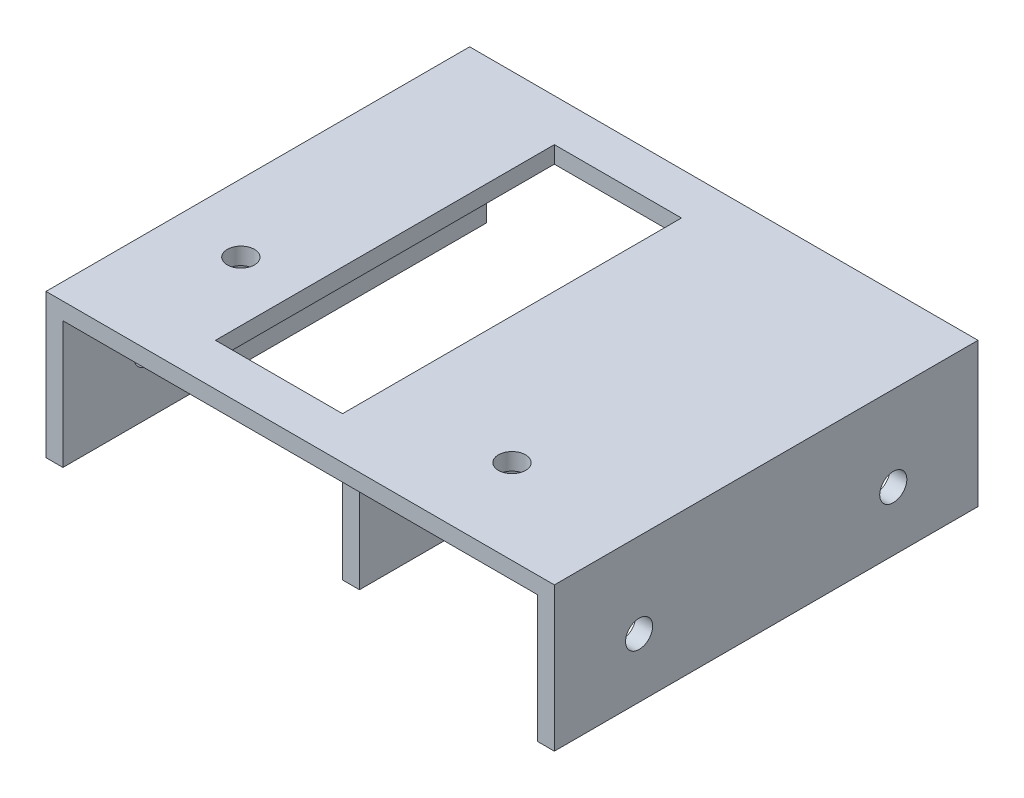
ISO-10303-21;
HEADER;
FILE_DESCRIPTION(('STEP AP214'),'2;1');
FILE_NAME('part.step','',(''),(''),'','','');
FILE_SCHEMA(('AUTOMOTIVE_DESIGN { 1 0 10303 214 1 1 1 1 }'));
ENDSEC;
DATA;
#1=APPLICATION_CONTEXT('core data for automotive mechanical design processes');
#2=APPLICATION_PROTOCOL_DEFINITION('international standard','automotive_design',2000,#1);
#3=PRODUCT_CONTEXT('',#1,'mechanical');
#4=PRODUCT('Part','Part','',(#3));
#5=PRODUCT_RELATED_PRODUCT_CATEGORY('part','',(#4));
#6=PRODUCT_DEFINITION_FORMATION('','',#4);
#7=PRODUCT_DEFINITION_CONTEXT('part definition',#1,'design');
#8=PRODUCT_DEFINITION('design','',#6,#7);
#9=PRODUCT_DEFINITION_SHAPE('','',#8);
#10=(LENGTH_UNIT() NAMED_UNIT(*) SI_UNIT(.MILLI.,.METRE.));
#11=(NAMED_UNIT(*) PLANE_ANGLE_UNIT() SI_UNIT($,.RADIAN.));
#12=(NAMED_UNIT(*) SI_UNIT($,.STERADIAN.) SOLID_ANGLE_UNIT());
#13=UNCERTAINTY_MEASURE_WITH_UNIT(LENGTH_MEASURE(1.E-05),#10,'distance_accuracy_value','');
#14=(GEOMETRIC_REPRESENTATION_CONTEXT(3) GLOBAL_UNCERTAINTY_ASSIGNED_CONTEXT((#13)) GLOBAL_UNIT_ASSIGNED_CONTEXT((#10,
#11,#12)) REPRESENTATION_CONTEXT('',''));
#15=CARTESIAN_POINT('',(0.,0.,0.));
#16=DIRECTION('',(0.,0.,1.));
#17=DIRECTION('',(1.,0.,0.));
#18=AXIS2_PLACEMENT_3D('',#15,#16,#17);
#19=CARTESIAN_POINT('',(0.,0.,50.));
#20=DIRECTION('',(0.,1.,0.));
#21=DIRECTION('',(0.,0.,1.));
#22=AXIS2_PLACEMENT_3D('',#19,#20,#21);
#23=PLANE('',#22);
#24=DIRECTION('',(1.,0.,0.));
#25=VECTOR('',#24,1.);
#26=CARTESIAN_POINT('',(0.,0.,0.));
#27=LINE('',#26,#25);
#28=CARTESIAN_POINT('',(0.,0.,0.));
#29=VERTEX_POINT('',#28);
#30=CARTESIAN_POINT('',(2.,0.,0.));
#31=VERTEX_POINT('',#30);
#32=EDGE_CURVE('E254',#29,#31,#27,.T.);
#33=ORIENTED_EDGE('',*,*,#32,.T.);
#34=DIRECTION('',(0.,0.,-1.));
#35=VECTOR('',#34,1.);
#36=CARTESIAN_POINT('',(2.,0.,50.));
#37=LINE('',#36,#35);
#38=CARTESIAN_POINT('',(2.,0.,50.));
#39=VERTEX_POINT('',#38);
#40=EDGE_CURVE('E11',#39,#31,#37,.T.);
#41=ORIENTED_EDGE('',*,*,#40,.F.);
#42=DIRECTION('',(1.,0.,0.));
#43=VECTOR('',#42,1.);
#44=CARTESIAN_POINT('',(0.,0.,50.));
#45=LINE('',#44,#43);
#46=CARTESIAN_POINT('',(0.,0.,50.));
#47=VERTEX_POINT('',#46);
#48=EDGE_CURVE('E255',#47,#39,#45,.T.);
#49=ORIENTED_EDGE('',*,*,#48,.F.);
#50=DIRECTION('',(0.,0.,-1.));
#51=VECTOR('',#50,1.);
#52=CARTESIAN_POINT('',(0.,0.,50.));
#53=LINE('',#52,#51);
#54=EDGE_CURVE('E273',#47,#29,#53,.T.);
#55=ORIENTED_EDGE('',*,*,#54,.T.);
#56=EDGE_LOOP('',(#33,#41,#49,#55));
#57=FACE_BOUND('',#56,.T.);
#58=ADVANCED_FACE('F33',(#57),#23,.F.);
#59=CARTESIAN_POINT('',(2.,0.,50.));
#60=DIRECTION('',(-1.,0.,0.));
#61=DIRECTION('',(0.,0.,1.));
#62=AXIS2_PLACEMENT_3D('',#59,#60,#61);
#63=PLANE('',#62);
#64=CARTESIAN_POINT('',(2.,7.00000000000003,10.));
#65=DIRECTION('',(-1.,0.,0.));
#66=DIRECTION('',(0.,0.,1.));
#67=AXIS2_PLACEMENT_3D('',#64,#65,#66);
#68=CIRCLE('',#67,1.6);
#69=CARTESIAN_POINT('',(2.,7.00000000000003,11.6));
#70=VERTEX_POINT('',#69);
#71=EDGE_CURVE('E239',#70,#70,#68,.T.);
#72=ORIENTED_EDGE('',*,*,#71,.T.);
#73=EDGE_LOOP('',(#72));
#74=FACE_BOUND('',#73,.T.);
#75=CARTESIAN_POINT('',(2.,7.00000000000003,40.));
#76=DIRECTION('',(-1.,0.,0.));
#77=DIRECTION('',(0.,0.,1.));
#78=AXIS2_PLACEMENT_3D('',#75,#76,#77);
#79=CIRCLE('',#78,1.6);
#80=CARTESIAN_POINT('',(2.,7.00000000000003,41.6));
#81=VERTEX_POINT('',#80);
#82=EDGE_CURVE('E251',#81,#81,#79,.T.);
#83=ORIENTED_EDGE('',*,*,#82,.T.);
#84=EDGE_LOOP('',(#83));
#85=FACE_BOUND('',#84,.T.);
#86=DIRECTION('',(0.,1.,0.));
#87=VECTOR('',#86,1.);
#88=CARTESIAN_POINT('',(2.,0.,0.));
#89=LINE('',#88,#87);
#90=CARTESIAN_POINT('',(2.,15.,0.));
#91=VERTEX_POINT('',#90);
#92=EDGE_CURVE('E276',#31,#91,#89,.T.);
#93=ORIENTED_EDGE('',*,*,#92,.T.);
#94=DIRECTION('',(0.,0.,-1.));
#95=VECTOR('',#94,1.);
#96=CARTESIAN_POINT('',(2.,15.,50.));
#97=LINE('',#96,#95);
#98=CARTESIAN_POINT('',(2.,15.,50.));
#99=VERTEX_POINT('',#98);
#100=EDGE_CURVE('E40',#99,#91,#97,.T.);
#101=ORIENTED_EDGE('',*,*,#100,.F.);
#102=DIRECTION('',(0.,1.,0.));
#103=VECTOR('',#102,1.);
#104=CARTESIAN_POINT('',(2.,0.,50.));
#105=LINE('',#104,#103);
#106=EDGE_CURVE('E258',#39,#99,#105,.T.);
#107=ORIENTED_EDGE('',*,*,#106,.F.);
#108=ORIENTED_EDGE('',*,*,#40,.T.);
#109=EDGE_LOOP('',(#93,#101,#107,#108));
#110=FACE_BOUND('',#109,.T.);
#111=ADVANCED_FACE('F333',(#74,#85,#110),#63,.F.);
#112=CARTESIAN_POINT('',(2.,15.,50.));
#113=DIRECTION('',(0.,1.,0.));
#114=DIRECTION('',(0.,0.,1.));
#115=AXIS2_PLACEMENT_3D('',#112,#113,#114);
#116=PLANE('',#115);
#117=CARTESIAN_POINT('',(8.,15.,35.));
#118=DIRECTION('',(0.,1.,0.));
#119=DIRECTION('',(0.,0.,1.));
#120=AXIS2_PLACEMENT_3D('',#117,#118,#119);
#121=CIRCLE('',#120,1.6);
#122=CARTESIAN_POINT('',(8.,15.,36.6));
#123=VERTEX_POINT('',#122);
#124=EDGE_CURVE('E182',#123,#123,#121,.T.);
#125=ORIENTED_EDGE('',*,*,#124,.T.);
#126=EDGE_LOOP('',(#125));
#127=FACE_BOUND('',#126,.T.);
#128=CARTESIAN_POINT('',(45.,15.,40.));
#129=DIRECTION('',(0.,1.,0.));
#130=DIRECTION('',(0.,0.,1.));
#131=AXIS2_PLACEMENT_3D('',#128,#129,#130);
#132=CIRCLE('',#131,1.6);
#133=CARTESIAN_POINT('',(45.,15.,41.6));
#134=VERTEX_POINT('',#133);
#135=EDGE_CURVE('E188',#134,#134,#132,.T.);
#136=ORIENTED_EDGE('',*,*,#135,.T.);
#137=EDGE_LOOP('',(#136));
#138=FACE_BOUND('',#137,.T.);
#139=DIRECTION('',(-1.,0.,0.));
#140=VECTOR('',#139,1.);
#141=CARTESIAN_POINT('',(2.,15.,5.));
#142=LINE('',#141,#140);
#143=CARTESIAN_POINT('',(32.,15.,5.));
#144=VERTEX_POINT('',#143);
#145=CARTESIAN_POINT('',(30.,15.,5.));
#146=VERTEX_POINT('',#145);
#147=EDGE_CURVE('E227',#144,#146,#142,.T.);
#148=ORIENTED_EDGE('',*,*,#147,.T.);
#149=DIRECTION('',(1.,0.,0.));
#150=VECTOR('',#149,1.);
#151=CARTESIAN_POINT('',(30.,15.,5.));
#152=LINE('',#151,#150);
#153=CARTESIAN_POINT('',(15.,15.,5.));
#154=VERTEX_POINT('',#153);
#155=EDGE_CURVE('E163',#154,#146,#152,.T.);
#156=ORIENTED_EDGE('',*,*,#155,.F.);
#157=DIRECTION('',(0.,0.,-1.));
#158=VECTOR('',#157,1.);
#159=CARTESIAN_POINT('',(15.,15.,5.));
#160=LINE('',#159,#158);
#161=CARTESIAN_POINT('',(15.,15.,45.));
#162=VERTEX_POINT('',#161);
#163=EDGE_CURVE('E165',#162,#154,#160,.T.);
#164=ORIENTED_EDGE('',*,*,#163,.F.);
#165=DIRECTION('',(-1.,0.,0.));
#166=VECTOR('',#165,1.);
#167=CARTESIAN_POINT('',(30.,15.,45.));
#168=LINE('',#167,#166);
#169=CARTESIAN_POINT('',(30.,15.,45.));
#170=VERTEX_POINT('',#169);
#171=EDGE_CURVE('E170',#170,#162,#168,.T.);
#172=ORIENTED_EDGE('',*,*,#171,.F.);
#173=DIRECTION('',(1.,0.,0.));
#174=VECTOR('',#173,1.);
#175=CARTESIAN_POINT('',(2.,15.,45.));
#176=LINE('',#175,#174);
#177=CARTESIAN_POINT('',(32.,15.,45.));
#178=VERTEX_POINT('',#177);
#179=EDGE_CURVE('E216',#170,#178,#176,.T.);
#180=ORIENTED_EDGE('',*,*,#179,.T.);
#181=DIRECTION('',(0.,0.,-1.));
#182=VECTOR('',#181,1.);
#183=CARTESIAN_POINT('',(32.,15.,50.));
#184=LINE('',#183,#182);
#185=EDGE_CURVE('E224',#178,#144,#184,.T.);
#186=ORIENTED_EDGE('',*,*,#185,.T.);
#187=EDGE_LOOP('',(#148,#156,#164,#172,#180,#186));
#188=FACE_BOUND('',#187,.T.);
#189=DIRECTION('',(1.,0.,0.));
#190=VECTOR('',#189,1.);
#191=CARTESIAN_POINT('',(2.,15.,0.));
#192=LINE('',#191,#190);
#193=CARTESIAN_POINT('',(58.,15.,0.));
#194=VERTEX_POINT('',#193);
#195=EDGE_CURVE('E278',#91,#194,#192,.T.);
#196=ORIENTED_EDGE('',*,*,#195,.T.);
#197=DIRECTION('',(0.,0.,-1.));
#198=VECTOR('',#197,1.);
#199=CARTESIAN_POINT('',(58.,15.,50.));
#200=LINE('',#199,#198);
#201=CARTESIAN_POINT('',(58.,15.,50.));
#202=VERTEX_POINT('',#201);
#203=EDGE_CURVE('E303',#202,#194,#200,.T.);
#204=ORIENTED_EDGE('',*,*,#203,.F.);
#205=DIRECTION('',(1.,0.,0.));
#206=VECTOR('',#205,1.);
#207=CARTESIAN_POINT('',(2.,15.,50.));
#208=LINE('',#207,#206);
#209=EDGE_CURVE('E261',#99,#202,#208,.T.);
#210=ORIENTED_EDGE('',*,*,#209,.F.);
#211=ORIENTED_EDGE('',*,*,#100,.T.);
#212=EDGE_LOOP('',(#196,#204,#210,#211));
#213=FACE_BOUND('',#212,.T.);
#214=ADVANCED_FACE('F310',(#127,#138,#188,#213),#116,.F.);
#215=CARTESIAN_POINT('',(58.,15.,50.));
#216=DIRECTION('',(1.,0.,0.));
#217=DIRECTION('',(0.,0.,-1.));
#218=AXIS2_PLACEMENT_3D('',#215,#216,#217);
#219=PLANE('',#218);
#220=CARTESIAN_POINT('',(58.,7.00000000000001,10.));
#221=DIRECTION('',(1.,0.,0.));
#222=DIRECTION('',(0.,0.,-1.));
#223=AXIS2_PLACEMENT_3D('',#220,#221,#222);
#224=CIRCLE('',#223,1.6);
#225=CARTESIAN_POINT('',(58.,7.00000000000001,8.4));
#226=VERTEX_POINT('',#225);
#227=EDGE_CURVE('E234',#226,#226,#224,.T.);
#228=ORIENTED_EDGE('',*,*,#227,.T.);
#229=EDGE_LOOP('',(#228));
#230=FACE_BOUND('',#229,.T.);
#231=CARTESIAN_POINT('',(58.,7.,40.));
#232=DIRECTION('',(1.,0.,0.));
#233=DIRECTION('',(0.,0.,-1.));
#234=AXIS2_PLACEMENT_3D('',#231,#232,#233);
#235=CIRCLE('',#234,1.6);
#236=CARTESIAN_POINT('',(58.,7.,38.4));
#237=VERTEX_POINT('',#236);
#238=EDGE_CURVE('E246',#237,#237,#235,.T.);
#239=ORIENTED_EDGE('',*,*,#238,.T.);
#240=EDGE_LOOP('',(#239));
#241=FACE_BOUND('',#240,.T.);
#242=DIRECTION('',(0.,-1.,0.));
#243=VECTOR('',#242,1.);
#244=CARTESIAN_POINT('',(58.,15.,0.));
#245=LINE('',#244,#243);
#246=CARTESIAN_POINT('',(58.,0.,0.));
#247=VERTEX_POINT('',#246);
#248=EDGE_CURVE('E280',#194,#247,#245,.T.);
#249=ORIENTED_EDGE('',*,*,#248,.T.);
#250=DIRECTION('',(0.,0.,-1.));
#251=VECTOR('',#250,1.);
#252=CARTESIAN_POINT('',(58.,0.,50.));
#253=LINE('',#252,#251);
#254=CARTESIAN_POINT('',(58.,0.,50.));
#255=VERTEX_POINT('',#254);
#256=EDGE_CURVE('E300',#255,#247,#253,.T.);
#257=ORIENTED_EDGE('',*,*,#256,.F.);
#258=DIRECTION('',(0.,-1.,0.));
#259=VECTOR('',#258,1.);
#260=CARTESIAN_POINT('',(58.,15.,50.));
#261=LINE('',#260,#259);
#262=EDGE_CURVE('E263',#202,#255,#261,.T.);
#263=ORIENTED_EDGE('',*,*,#262,.F.);
#264=ORIENTED_EDGE('',*,*,#203,.T.);
#265=EDGE_LOOP('',(#249,#257,#263,#264));
#266=FACE_BOUND('',#265,.T.);
#267=ADVANCED_FACE('F321',(#230,#241,#266),#219,.F.);
#268=CARTESIAN_POINT('',(58.,0.,50.));
#269=DIRECTION('',(0.,1.,0.));
#270=DIRECTION('',(0.,0.,1.));
#271=AXIS2_PLACEMENT_3D('',#268,#269,#270);
#272=PLANE('',#271);
#273=DIRECTION('',(1.,0.,0.));
#274=VECTOR('',#273,1.);
#275=CARTESIAN_POINT('',(58.,0.,0.));
#276=LINE('',#275,#274);
#277=CARTESIAN_POINT('',(60.,0.,0.));
#278=VERTEX_POINT('',#277);
#279=EDGE_CURVE('E282',#247,#278,#276,.T.);
#280=ORIENTED_EDGE('',*,*,#279,.T.);
#281=DIRECTION('',(0.,0.,-1.));
#282=VECTOR('',#281,1.);
#283=CARTESIAN_POINT('',(60.,0.,50.));
#284=LINE('',#283,#282);
#285=CARTESIAN_POINT('',(60.,0.,50.));
#286=VERTEX_POINT('',#285);
#287=EDGE_CURVE('E297',#286,#278,#284,.T.);
#288=ORIENTED_EDGE('',*,*,#287,.F.);
#289=DIRECTION('',(1.,0.,0.));
#290=VECTOR('',#289,1.);
#291=CARTESIAN_POINT('',(58.,0.,50.));
#292=LINE('',#291,#290);
#293=EDGE_CURVE('E265',#255,#286,#292,.T.);
#294=ORIENTED_EDGE('',*,*,#293,.F.);
#295=ORIENTED_EDGE('',*,*,#256,.T.);
#296=EDGE_LOOP('',(#280,#288,#294,#295));
#297=FACE_BOUND('',#296,.T.);
#298=ADVANCED_FACE('F325',(#297),#272,.F.);
#299=CARTESIAN_POINT('',(60.,17.,50.));
#300=DIRECTION('',(-1.,0.,0.));
#301=DIRECTION('',(0.,-1.,0.));
#302=AXIS2_PLACEMENT_3D('',#299,#300,#301);
#303=PLANE('',#302);
#304=CARTESIAN_POINT('',(60.,7.00000000000001,10.));
#305=DIRECTION('',(1.,0.,0.));
#306=DIRECTION('',(0.,-1.,0.));
#307=AXIS2_PLACEMENT_3D('',#304,#305,#306);
#308=CIRCLE('',#307,1.6);
#309=CARTESIAN_POINT('',(60.,5.40000000000001,10.));
#310=VERTEX_POINT('',#309);
#311=EDGE_CURVE('E230',#310,#310,#308,.T.);
#312=ORIENTED_EDGE('',*,*,#311,.F.);
#313=EDGE_LOOP('',(#312));
#314=FACE_BOUND('',#313,.T.);
#315=CARTESIAN_POINT('',(60.,7.,40.));
#316=DIRECTION('',(1.,0.,0.));
#317=DIRECTION('',(0.,1.,0.));
#318=AXIS2_PLACEMENT_3D('',#315,#316,#317);
#319=CIRCLE('',#318,1.6);
#320=CARTESIAN_POINT('',(60.,8.6,40.));
#321=VERTEX_POINT('',#320);
#322=EDGE_CURVE('E242',#321,#321,#319,.T.);
#323=ORIENTED_EDGE('',*,*,#322,.F.);
#324=EDGE_LOOP('',(#323));
#325=FACE_BOUND('',#324,.T.);
#326=DIRECTION('',(0.,1.,0.));
#327=VECTOR('',#326,1.);
#328=CARTESIAN_POINT('',(60.,17.,0.));
#329=LINE('',#328,#327);
#330=CARTESIAN_POINT('',(60.,17.,0.));
#331=VERTEX_POINT('',#330);
#332=EDGE_CURVE('E284',#278,#331,#329,.T.);
#333=ORIENTED_EDGE('',*,*,#332,.T.);
#334=DIRECTION('',(0.,0.,-1.));
#335=VECTOR('',#334,1.);
#336=CARTESIAN_POINT('',(60.,17.,50.));
#337=LINE('',#336,#335);
#338=CARTESIAN_POINT('',(60.,17.,50.));
#339=VERTEX_POINT('',#338);
#340=EDGE_CURVE('E294',#339,#331,#337,.T.);
#341=ORIENTED_EDGE('',*,*,#340,.F.);
#342=DIRECTION('',(0.,1.,0.));
#343=VECTOR('',#342,1.);
#344=CARTESIAN_POINT('',(60.,17.,50.));
#345=LINE('',#344,#343);
#346=EDGE_CURVE('E267',#286,#339,#345,.T.);
#347=ORIENTED_EDGE('',*,*,#346,.F.);
#348=ORIENTED_EDGE('',*,*,#287,.T.);
#349=EDGE_LOOP('',(#333,#341,#347,#348));
#350=FACE_BOUND('',#349,.T.);
#351=ADVANCED_FACE('F345',(#314,#325,#350),#303,.F.);
#352=CARTESIAN_POINT('',(0.,17.,50.));
#353=DIRECTION('',(0.,-1.,0.));
#354=DIRECTION('',(0.,0.,-1.));
#355=AXIS2_PLACEMENT_3D('',#352,#353,#354);
#356=PLANE('',#355);
#357=DIRECTION('',(1.,0.,0.));
#358=VECTOR('',#357,1.);
#359=CARTESIAN_POINT('',(30.,17.,5.));
#360=LINE('',#359,#358);
#361=CARTESIAN_POINT('',(15.,17.,5.));
#362=VERTEX_POINT('',#361);
#363=CARTESIAN_POINT('',(30.,17.,5.));
#364=VERTEX_POINT('',#363);
#365=EDGE_CURVE('E153',#362,#364,#360,.T.);
#366=ORIENTED_EDGE('',*,*,#365,.T.);
#367=DIRECTION('',(0.,0.,1.));
#368=VECTOR('',#367,1.);
#369=CARTESIAN_POINT('',(30.,17.,5.));
#370=LINE('',#369,#368);
#371=CARTESIAN_POINT('',(30.,17.,45.));
#372=VERTEX_POINT('',#371);
#373=EDGE_CURVE('E145',#364,#372,#370,.T.);
#374=ORIENTED_EDGE('',*,*,#373,.T.);
#375=DIRECTION('',(-1.,0.,0.));
#376=VECTOR('',#375,1.);
#377=CARTESIAN_POINT('',(30.,17.,45.));
#378=LINE('',#377,#376);
#379=CARTESIAN_POINT('',(15.,17.,45.));
#380=VERTEX_POINT('',#379);
#381=EDGE_CURVE('E156',#372,#380,#378,.T.);
#382=ORIENTED_EDGE('',*,*,#381,.T.);
#383=DIRECTION('',(0.,0.,-1.));
#384=VECTOR('',#383,1.);
#385=CARTESIAN_POINT('',(15.,17.,5.));
#386=LINE('',#385,#384);
#387=EDGE_CURVE('E47',#380,#362,#386,.T.);
#388=ORIENTED_EDGE('',*,*,#387,.T.);
#389=EDGE_LOOP('',(#366,#374,#382,#388));
#390=FACE_BOUND('',#389,.T.);
#391=CARTESIAN_POINT('',(8.,17.,35.));
#392=DIRECTION('',(0.,1.,0.));
#393=DIRECTION('',(0.,0.,1.));
#394=AXIS2_PLACEMENT_3D('',#391,#392,#393);
#395=CIRCLE('',#394,1.6);
#396=CARTESIAN_POINT('',(8.,17.,36.6));
#397=VERTEX_POINT('',#396);
#398=EDGE_CURVE('E176',#397,#397,#395,.T.);
#399=ORIENTED_EDGE('',*,*,#398,.F.);
#400=EDGE_LOOP('',(#399));
#401=FACE_BOUND('',#400,.T.);
#402=CARTESIAN_POINT('',(45.,17.,40.));
#403=DIRECTION('',(0.,1.,0.));
#404=DIRECTION('',(0.,0.,1.));
#405=AXIS2_PLACEMENT_3D('',#402,#403,#404);
#406=CIRCLE('',#405,1.6);
#407=CARTESIAN_POINT('',(45.,17.,41.6));
#408=VERTEX_POINT('',#407);
#409=EDGE_CURVE('E185',#408,#408,#406,.T.);
#410=ORIENTED_EDGE('',*,*,#409,.F.);
#411=EDGE_LOOP('',(#410));
#412=FACE_BOUND('',#411,.T.);
#413=DIRECTION('',(-1.,0.,0.));
#414=VECTOR('',#413,1.);
#415=CARTESIAN_POINT('',(0.,17.,0.));
#416=LINE('',#415,#414);
#417=CARTESIAN_POINT('',(0.,17.,0.));
#418=VERTEX_POINT('',#417);
#419=EDGE_CURVE('E286',#331,#418,#416,.T.);
#420=ORIENTED_EDGE('',*,*,#419,.T.);
#421=DIRECTION('',(0.,0.,-1.));
#422=VECTOR('',#421,1.);
#423=CARTESIAN_POINT('',(0.,17.,50.));
#424=LINE('',#423,#422);
#425=CARTESIAN_POINT('',(0.,17.,50.));
#426=VERTEX_POINT('',#425);
#427=EDGE_CURVE('E291',#426,#418,#424,.T.);
#428=ORIENTED_EDGE('',*,*,#427,.F.);
#429=DIRECTION('',(-1.,0.,0.));
#430=VECTOR('',#429,1.);
#431=CARTESIAN_POINT('',(0.,17.,50.));
#432=LINE('',#431,#430);
#433=EDGE_CURVE('E269',#339,#426,#432,.T.);
#434=ORIENTED_EDGE('',*,*,#433,.F.);
#435=ORIENTED_EDGE('',*,*,#340,.T.);
#436=EDGE_LOOP('',(#420,#428,#434,#435));
#437=FACE_BOUND('',#436,.T.);
#438=ADVANCED_FACE('F160',(#390,#401,#412,#437),#356,.F.);
#439=CARTESIAN_POINT('',(0.,0.,50.));
#440=DIRECTION('',(1.,0.,0.));
#441=DIRECTION('',(0.,0.,-1.));
#442=AXIS2_PLACEMENT_3D('',#439,#440,#441);
#443=PLANE('',#442);
#444=CARTESIAN_POINT('',(0.,7.00000000000003,10.));
#445=DIRECTION('',(1.,0.,0.));
#446=DIRECTION('',(0.,-1.,0.));
#447=AXIS2_PLACEMENT_3D('',#444,#445,#446);
#448=CIRCLE('',#447,1.6);
#449=CARTESIAN_POINT('',(0.,5.40000000000004,10.));
#450=VERTEX_POINT('',#449);
#451=EDGE_CURVE('E231',#450,#450,#448,.T.);
#452=ORIENTED_EDGE('',*,*,#451,.T.);
#453=EDGE_LOOP('',(#452));
#454=FACE_BOUND('',#453,.T.);
#455=CARTESIAN_POINT('',(0.,7.00000000000003,40.));
#456=DIRECTION('',(1.,0.,0.));
#457=DIRECTION('',(0.,1.,0.));
#458=AXIS2_PLACEMENT_3D('',#455,#456,#457);
#459=CIRCLE('',#458,1.6);
#460=CARTESIAN_POINT('',(0.,8.60000000000003,40.));
#461=VERTEX_POINT('',#460);
#462=EDGE_CURVE('E243',#461,#461,#459,.T.);
#463=ORIENTED_EDGE('',*,*,#462,.T.);
#464=EDGE_LOOP('',(#463));
#465=FACE_BOUND('',#464,.T.);
#466=DIRECTION('',(0.,-1.,0.));
#467=VECTOR('',#466,1.);
#468=CARTESIAN_POINT('',(0.,0.,0.));
#469=LINE('',#468,#467);
#470=EDGE_CURVE('E259',#418,#29,#469,.T.);
#471=ORIENTED_EDGE('',*,*,#470,.T.);
#472=ORIENTED_EDGE('',*,*,#54,.F.);
#473=DIRECTION('',(0.,-1.,0.));
#474=VECTOR('',#473,1.);
#475=CARTESIAN_POINT('',(0.,0.,50.));
#476=LINE('',#475,#474);
#477=EDGE_CURVE('E271',#426,#47,#476,.T.);
#478=ORIENTED_EDGE('',*,*,#477,.F.);
#479=ORIENTED_EDGE('',*,*,#427,.T.);
#480=EDGE_LOOP('',(#471,#472,#478,#479));
#481=FACE_BOUND('',#480,.T.);
#482=ADVANCED_FACE('F339',(#454,#465,#481),#443,.F.);
#483=CARTESIAN_POINT('',(0.,0.,50.));
#484=DIRECTION('',(0.,0.,1.));
#485=DIRECTION('',(1.,0.,0.));
#486=AXIS2_PLACEMENT_3D('',#483,#484,#485);
#487=PLANE('',#486);
#488=ORIENTED_EDGE('',*,*,#48,.T.);
#489=ORIENTED_EDGE('',*,*,#106,.T.);
#490=ORIENTED_EDGE('',*,*,#209,.T.);
#491=ORIENTED_EDGE('',*,*,#262,.T.);
#492=ORIENTED_EDGE('',*,*,#293,.T.);
#493=ORIENTED_EDGE('',*,*,#346,.T.);
#494=ORIENTED_EDGE('',*,*,#433,.T.);
#495=ORIENTED_EDGE('',*,*,#477,.T.);
#496=EDGE_LOOP('',(#488,#489,#490,#491,#492,#493,#494,#495));
#497=FACE_BOUND('',#496,.T.);
#498=ADVANCED_FACE('F329',(#497),#487,.T.);
#499=CARTESIAN_POINT('',(0.,0.,0.));
#500=DIRECTION('',(0.,0.,1.));
#501=DIRECTION('',(1.,0.,0.));
#502=AXIS2_PLACEMENT_3D('',#499,#500,#501);
#503=PLANE('',#502);
#504=ORIENTED_EDGE('',*,*,#32,.F.);
#505=ORIENTED_EDGE('',*,*,#470,.F.);
#506=ORIENTED_EDGE('',*,*,#419,.F.);
#507=ORIENTED_EDGE('',*,*,#332,.F.);
#508=ORIENTED_EDGE('',*,*,#279,.F.);
#509=ORIENTED_EDGE('',*,*,#248,.F.);
#510=ORIENTED_EDGE('',*,*,#195,.F.);
#511=ORIENTED_EDGE('',*,*,#92,.F.);
#512=EDGE_LOOP('',(#504,#505,#506,#507,#508,#509,#510,#511));
#513=FACE_BOUND('',#512,.T.);
#514=ADVANCED_FACE('F316',(#513),#503,.F.);
#515=CARTESIAN_POINT('',(0.,7.00000000000003,40.));
#516=DIRECTION('',(1.,0.,0.));
#517=DIRECTION('',(0.,1.,0.));
#518=AXIS2_PLACEMENT_3D('',#515,#516,#517);
#519=CYLINDRICAL_SURFACE('',#518,1.6);
#520=ORIENTED_EDGE('',*,*,#462,.F.);
#521=EDGE_LOOP('',(#520));
#522=FACE_BOUND('',#521,.T.);
#523=ORIENTED_EDGE('',*,*,#82,.F.);
#524=EDGE_LOOP('',(#523));
#525=FACE_BOUND('',#524,.T.);
#526=ADVANCED_FACE('F380',(#522,#525),#519,.F.);
#527=ORIENTED_EDGE('',*,*,#322,.T.);
#528=EDGE_LOOP('',(#527));
#529=FACE_BOUND('',#528,.T.);
#530=ORIENTED_EDGE('',*,*,#238,.F.);
#531=EDGE_LOOP('',(#530));
#532=FACE_BOUND('',#531,.T.);
#533=ADVANCED_FACE('F377',(#529,#532),#519,.F.);
#534=CARTESIAN_POINT('',(0.,7.00000000000003,10.));
#535=DIRECTION('',(1.,0.,0.));
#536=DIRECTION('',(0.,1.,0.));
#537=AXIS2_PLACEMENT_3D('',#534,#535,#536);
#538=CYLINDRICAL_SURFACE('',#537,1.6);
#539=ORIENTED_EDGE('',*,*,#451,.F.);
#540=EDGE_LOOP('',(#539));
#541=FACE_BOUND('',#540,.T.);
#542=ORIENTED_EDGE('',*,*,#71,.F.);
#543=EDGE_LOOP('',(#542));
#544=FACE_BOUND('',#543,.T.);
#545=ADVANCED_FACE('F379',(#541,#544),#538,.F.);
#546=ORIENTED_EDGE('',*,*,#311,.T.);
#547=EDGE_LOOP('',(#546));
#548=FACE_BOUND('',#547,.T.);
#549=ORIENTED_EDGE('',*,*,#227,.F.);
#550=EDGE_LOOP('',(#549));
#551=FACE_BOUND('',#550,.T.);
#552=ADVANCED_FACE('F387',(#548,#551),#538,.F.);
#553=CARTESIAN_POINT('',(30.,0.,5.));
#554=DIRECTION('',(-1.,0.,0.));
#555=DIRECTION('',(0.,0.,1.));
#556=AXIS2_PLACEMENT_3D('',#553,#554,#555);
#557=PLANE('',#556);
#558=CARTESIAN_POINT('',(30.,5.,13.));
#559=DIRECTION('',(1.,0.,0.));
#560=DIRECTION('',(0.,0.,1.));
#561=AXIS2_PLACEMENT_3D('',#558,#559,#560);
#562=CIRCLE('',#561,1.6);
#563=CARTESIAN_POINT('',(30.,5.,14.6));
#564=VERTEX_POINT('',#563);
#565=EDGE_CURVE('E192',#564,#564,#562,.T.);
#566=ORIENTED_EDGE('',*,*,#565,.T.);
#567=EDGE_LOOP('',(#566));
#568=FACE_BOUND('',#567,.T.);
#569=CARTESIAN_POINT('',(30.,5.,37.));
#570=DIRECTION('',(1.,0.,0.));
#571=DIRECTION('',(0.,0.,-1.));
#572=AXIS2_PLACEMENT_3D('',#569,#570,#571);
#573=CIRCLE('',#572,1.6);
#574=CARTESIAN_POINT('',(30.,5.,35.4));
#575=VERTEX_POINT('',#574);
#576=EDGE_CURVE('E198',#575,#575,#573,.T.);
#577=ORIENTED_EDGE('',*,*,#576,.T.);
#578=EDGE_LOOP('',(#577));
#579=FACE_BOUND('',#578,.T.);
#580=DIRECTION('',(0.,1.,0.));
#581=VECTOR('',#580,1.);
#582=CARTESIAN_POINT('',(30.,0.,45.));
#583=LINE('',#582,#581);
#584=CARTESIAN_POINT('',(30.,0.,45.));
#585=VERTEX_POINT('',#584);
#586=EDGE_CURVE('E148',#585,#170,#583,.T.);
#587=ORIENTED_EDGE('',*,*,#586,.T.);
#588=DIRECTION('',(0.,-1.,0.));
#589=VECTOR('',#588,1.);
#590=CARTESIAN_POINT('',(30.,17.,45.));
#591=LINE('',#590,#589);
#592=EDGE_CURVE('E140',#372,#170,#591,.T.);
#593=ORIENTED_EDGE('',*,*,#592,.F.);
#594=ORIENTED_EDGE('',*,*,#373,.F.);
#595=DIRECTION('',(0.,-1.,0.));
#596=VECTOR('',#595,1.);
#597=CARTESIAN_POINT('',(30.,17.,5.));
#598=LINE('',#597,#596);
#599=EDGE_CURVE('E174',#364,#146,#598,.T.);
#600=ORIENTED_EDGE('',*,*,#599,.T.);
#601=DIRECTION('',(0.,1.,0.));
#602=VECTOR('',#601,1.);
#603=CARTESIAN_POINT('',(30.,0.,5.));
#604=LINE('',#603,#602);
#605=CARTESIAN_POINT('',(30.,0.,5.));
#606=VERTEX_POINT('',#605);
#607=EDGE_CURVE('E213',#606,#146,#604,.T.);
#608=ORIENTED_EDGE('',*,*,#607,.F.);
#609=DIRECTION('',(0.,0.,1.));
#610=VECTOR('',#609,1.);
#611=CARTESIAN_POINT('',(30.,0.,5.));
#612=LINE('',#611,#610);
#613=EDGE_CURVE('E201',#606,#585,#612,.T.);
#614=ORIENTED_EDGE('',*,*,#613,.T.);
#615=EDGE_LOOP('',(#587,#593,#594,#600,#608,#614));
#616=FACE_BOUND('',#615,.T.);
#617=ADVANCED_FACE('F142',(#568,#579,#616),#557,.T.);
#618=CARTESIAN_POINT('',(30.,0.,5.));
#619=DIRECTION('',(0.,0.,-1.));
#620=DIRECTION('',(-1.,0.,0.));
#621=AXIS2_PLACEMENT_3D('',#618,#619,#620);
#622=PLANE('',#621);
#623=ORIENTED_EDGE('',*,*,#147,.F.);
#624=DIRECTION('',(0.,1.,0.));
#625=VECTOR('',#624,1.);
#626=CARTESIAN_POINT('',(32.,0.,5.));
#627=LINE('',#626,#625);
#628=CARTESIAN_POINT('',(32.,0.,5.));
#629=VERTEX_POINT('',#628);
#630=EDGE_CURVE('E217',#629,#144,#627,.T.);
#631=ORIENTED_EDGE('',*,*,#630,.F.);
#632=DIRECTION('',(-1.,0.,0.));
#633=VECTOR('',#632,1.);
#634=CARTESIAN_POINT('',(30.,0.,5.));
#635=LINE('',#634,#633);
#636=EDGE_CURVE('E210',#629,#606,#635,.T.);
#637=ORIENTED_EDGE('',*,*,#636,.T.);
#638=ORIENTED_EDGE('',*,*,#607,.T.);
#639=EDGE_LOOP('',(#623,#631,#637,#638));
#640=FACE_BOUND('',#639,.T.);
#641=ADVANCED_FACE('F469',(#640),#622,.T.);
#642=CARTESIAN_POINT('',(32.,0.,5.));
#643=DIRECTION('',(1.,0.,0.));
#644=DIRECTION('',(0.,0.,-1.));
#645=AXIS2_PLACEMENT_3D('',#642,#643,#644);
#646=PLANE('',#645);
#647=CARTESIAN_POINT('',(32.,5.,13.));
#648=DIRECTION('',(1.,0.,0.));
#649=DIRECTION('',(0.,0.,1.));
#650=AXIS2_PLACEMENT_3D('',#647,#648,#649);
#651=CIRCLE('',#650,1.6);
#652=CARTESIAN_POINT('',(32.,5.,14.6));
#653=VERTEX_POINT('',#652);
#654=EDGE_CURVE('E191',#653,#653,#651,.T.);
#655=ORIENTED_EDGE('',*,*,#654,.F.);
#656=EDGE_LOOP('',(#655));
#657=FACE_BOUND('',#656,.T.);
#658=CARTESIAN_POINT('',(32.,5.,37.));
#659=DIRECTION('',(1.,0.,0.));
#660=DIRECTION('',(0.,0.,-1.));
#661=AXIS2_PLACEMENT_3D('',#658,#659,#660);
#662=CIRCLE('',#661,1.6);
#663=CARTESIAN_POINT('',(32.,5.,35.4));
#664=VERTEX_POINT('',#663);
#665=EDGE_CURVE('E195',#664,#664,#662,.T.);
#666=ORIENTED_EDGE('',*,*,#665,.F.);
#667=EDGE_LOOP('',(#666));
#668=FACE_BOUND('',#667,.T.);
#669=ORIENTED_EDGE('',*,*,#185,.F.);
#670=DIRECTION('',(0.,1.,0.));
#671=VECTOR('',#670,1.);
#672=CARTESIAN_POINT('',(32.,0.,45.));
#673=LINE('',#672,#671);
#674=CARTESIAN_POINT('',(32.,0.,45.));
#675=VERTEX_POINT('',#674);
#676=EDGE_CURVE('E55',#675,#178,#673,.T.);
#677=ORIENTED_EDGE('',*,*,#676,.F.);
#678=DIRECTION('',(0.,0.,-1.));
#679=VECTOR('',#678,1.);
#680=CARTESIAN_POINT('',(32.,0.,5.));
#681=LINE('',#680,#679);
#682=EDGE_CURVE('E207',#675,#629,#681,.T.);
#683=ORIENTED_EDGE('',*,*,#682,.T.);
#684=ORIENTED_EDGE('',*,*,#630,.T.);
#685=EDGE_LOOP('',(#669,#677,#683,#684));
#686=FACE_BOUND('',#685,.T.);
#687=ADVANCED_FACE('F464',(#657,#668,#686),#646,.T.);
#688=CARTESIAN_POINT('',(30.,0.,45.));
#689=DIRECTION('',(0.,0.,1.));
#690=DIRECTION('',(1.,0.,0.));
#691=AXIS2_PLACEMENT_3D('',#688,#689,#690);
#692=PLANE('',#691);
#693=ORIENTED_EDGE('',*,*,#179,.F.);
#694=ORIENTED_EDGE('',*,*,#586,.F.);
#695=DIRECTION('',(1.,0.,0.));
#696=VECTOR('',#695,1.);
#697=CARTESIAN_POINT('',(30.,0.,45.));
#698=LINE('',#697,#696);
#699=EDGE_CURVE('E205',#585,#675,#698,.T.);
#700=ORIENTED_EDGE('',*,*,#699,.T.);
#701=ORIENTED_EDGE('',*,*,#676,.T.);
#702=EDGE_LOOP('',(#693,#694,#700,#701));
#703=FACE_BOUND('',#702,.T.);
#704=ADVANCED_FACE('F454',(#703),#692,.T.);
#705=CARTESIAN_POINT('',(0.,0.,0.));
#706=DIRECTION('',(0.,1.,0.));
#707=DIRECTION('',(0.,0.,1.));
#708=AXIS2_PLACEMENT_3D('',#705,#706,#707);
#709=PLANE('',#708);
#710=ORIENTED_EDGE('',*,*,#613,.F.);
#711=ORIENTED_EDGE('',*,*,#636,.F.);
#712=ORIENTED_EDGE('',*,*,#682,.F.);
#713=ORIENTED_EDGE('',*,*,#699,.F.);
#714=EDGE_LOOP('',(#710,#711,#712,#713));
#715=FACE_BOUND('',#714,.T.);
#716=ADVANCED_FACE('F448',(#715),#709,.F.);
#717=CARTESIAN_POINT('',(30.,5.,37.));
#718=DIRECTION('',(1.,0.,0.));
#719=DIRECTION('',(0.,0.,-1.));
#720=AXIS2_PLACEMENT_3D('',#717,#718,#719);
#721=CYLINDRICAL_SURFACE('',#720,1.6);
#722=ORIENTED_EDGE('',*,*,#576,.F.);
#723=EDGE_LOOP('',(#722));
#724=FACE_BOUND('',#723,.T.);
#725=ORIENTED_EDGE('',*,*,#665,.T.);
#726=EDGE_LOOP('',(#725));
#727=FACE_BOUND('',#726,.T.);
#728=ADVANCED_FACE('F453',(#724,#727),#721,.F.);
#729=CARTESIAN_POINT('',(30.,5.,13.));
#730=DIRECTION('',(1.,0.,0.));
#731=DIRECTION('',(0.,0.,-1.));
#732=AXIS2_PLACEMENT_3D('',#729,#730,#731);
#733=CYLINDRICAL_SURFACE('',#732,1.6);
#734=ORIENTED_EDGE('',*,*,#565,.F.);
#735=EDGE_LOOP('',(#734));
#736=FACE_BOUND('',#735,.T.);
#737=ORIENTED_EDGE('',*,*,#654,.T.);
#738=EDGE_LOOP('',(#737));
#739=FACE_BOUND('',#738,.T.);
#740=ADVANCED_FACE('F479',(#736,#739),#733,.F.);
#741=CARTESIAN_POINT('',(45.,0.,40.));
#742=DIRECTION('',(0.,1.,0.));
#743=DIRECTION('',(0.,0.,1.));
#744=AXIS2_PLACEMENT_3D('',#741,#742,#743);
#745=CYLINDRICAL_SURFACE('',#744,1.6);
#746=ORIENTED_EDGE('',*,*,#409,.T.);
#747=EDGE_LOOP('',(#746));
#748=FACE_BOUND('',#747,.T.);
#749=ORIENTED_EDGE('',*,*,#135,.F.);
#750=EDGE_LOOP('',(#749));
#751=FACE_BOUND('',#750,.T.);
#752=ADVANCED_FACE('F489',(#748,#751),#745,.F.);
#753=CARTESIAN_POINT('',(8.,0.,35.));
#754=DIRECTION('',(0.,1.,0.));
#755=DIRECTION('',(0.,0.,1.));
#756=AXIS2_PLACEMENT_3D('',#753,#754,#755);
#757=CYLINDRICAL_SURFACE('',#756,1.6);
#758=ORIENTED_EDGE('',*,*,#398,.T.);
#759=EDGE_LOOP('',(#758));
#760=FACE_BOUND('',#759,.T.);
#761=ORIENTED_EDGE('',*,*,#124,.F.);
#762=EDGE_LOOP('',(#761));
#763=FACE_BOUND('',#762,.T.);
#764=ADVANCED_FACE('F499',(#760,#763),#757,.F.);
#765=CARTESIAN_POINT('',(30.,17.,5.));
#766=DIRECTION('',(0.,0.,-1.));
#767=DIRECTION('',(-1.,0.,0.));
#768=AXIS2_PLACEMENT_3D('',#765,#766,#767);
#769=PLANE('',#768);
#770=ORIENTED_EDGE('',*,*,#155,.T.);
#771=ORIENTED_EDGE('',*,*,#599,.F.);
#772=ORIENTED_EDGE('',*,*,#365,.F.);
#773=DIRECTION('',(0.,-1.,0.));
#774=VECTOR('',#773,1.);
#775=CARTESIAN_POINT('',(15.,17.,5.));
#776=LINE('',#775,#774);
#777=EDGE_CURVE('E177',#362,#154,#776,.T.);
#778=ORIENTED_EDGE('',*,*,#777,.T.);
#779=EDGE_LOOP('',(#770,#771,#772,#778));
#780=FACE_BOUND('',#779,.T.);
#781=ADVANCED_FACE('F509',(#780),#769,.F.);
#782=CARTESIAN_POINT('',(15.,17.,5.));
#783=DIRECTION('',(-1.,0.,0.));
#784=DIRECTION('',(0.,0.,1.));
#785=AXIS2_PLACEMENT_3D('',#782,#783,#784);
#786=PLANE('',#785);
#787=ORIENTED_EDGE('',*,*,#163,.T.);
#788=ORIENTED_EDGE('',*,*,#777,.F.);
#789=ORIENTED_EDGE('',*,*,#387,.F.);
#790=DIRECTION('',(0.,-1.,0.));
#791=VECTOR('',#790,1.);
#792=CARTESIAN_POINT('',(15.,17.,45.));
#793=LINE('',#792,#791);
#794=EDGE_CURVE('E152',#380,#162,#793,.T.);
#795=ORIENTED_EDGE('',*,*,#794,.T.);
#796=EDGE_LOOP('',(#787,#788,#789,#795));
#797=FACE_BOUND('',#796,.T.);
#798=ADVANCED_FACE('F552',(#797),#786,.F.);
#799=CARTESIAN_POINT('',(30.,17.,45.));
#800=DIRECTION('',(0.,0.,1.));
#801=DIRECTION('',(1.,0.,0.));
#802=AXIS2_PLACEMENT_3D('',#799,#800,#801);
#803=PLANE('',#802);
#804=ORIENTED_EDGE('',*,*,#171,.T.);
#805=ORIENTED_EDGE('',*,*,#794,.F.);
#806=ORIENTED_EDGE('',*,*,#381,.F.);
#807=ORIENTED_EDGE('',*,*,#592,.T.);
#808=EDGE_LOOP('',(#804,#805,#806,#807));
#809=FACE_BOUND('',#808,.T.);
#810=ADVANCED_FACE('F157',(#809),#803,.F.);
#811=CLOSED_SHELL('',(#58,#111,#214,#267,#298,#351,#438,#482,#498,#514,#526,#533,#545,#552,#617,
#641,#687,#704,#716,#728,#740,#752,#764,#781,#798,#810));
#812=MANIFOLD_SOLID_BREP('B2',#811);
#813=ADVANCED_BREP_SHAPE_REPRESENTATION('',(#18,#812),#14);
#814=SHAPE_DEFINITION_REPRESENTATION(#9,#813);
ENDSEC;
END-ISO-10303-21;
